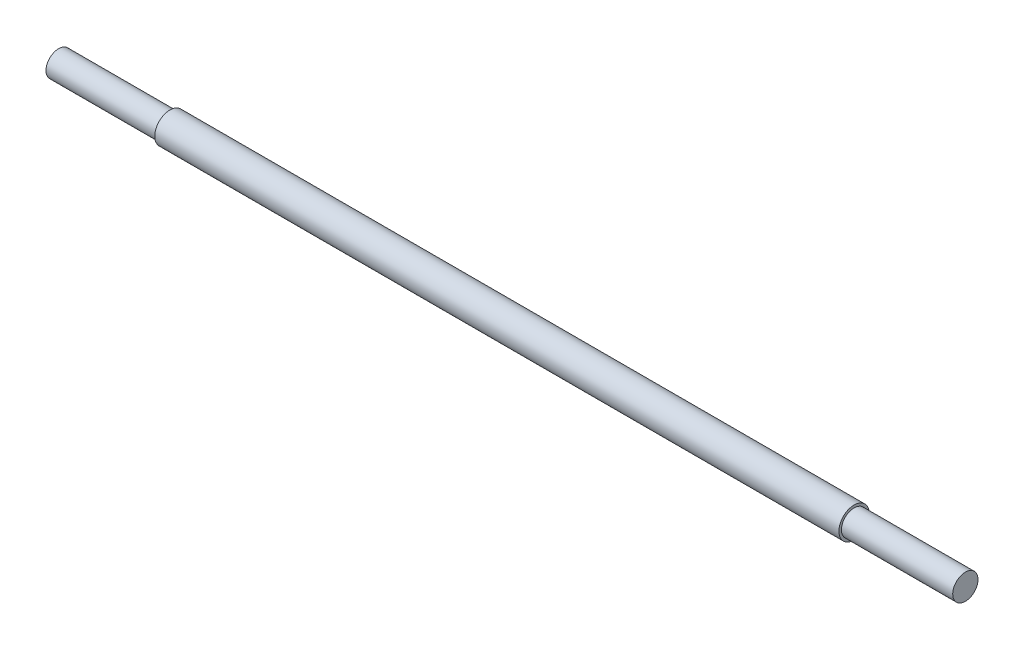
ISO-10303-21;
HEADER;
FILE_DESCRIPTION(('STEP AP214'),'2;1');
FILE_NAME('part.step','',(''),(''),'','','');
FILE_SCHEMA(('AUTOMOTIVE_DESIGN { 1 0 10303 214 1 1 1 1 }'));
ENDSEC;
DATA;
#1=APPLICATION_CONTEXT('core data for automotive mechanical design processes');
#2=APPLICATION_PROTOCOL_DEFINITION('international standard','automotive_design',2000,#1);
#3=PRODUCT_CONTEXT('',#1,'mechanical');
#4=PRODUCT('Part','Part','',(#3));
#5=PRODUCT_RELATED_PRODUCT_CATEGORY('part','',(#4));
#6=PRODUCT_DEFINITION_FORMATION('','',#4);
#7=PRODUCT_DEFINITION_CONTEXT('part definition',#1,'design');
#8=PRODUCT_DEFINITION('design','',#6,#7);
#9=PRODUCT_DEFINITION_SHAPE('','',#8);
#10=(LENGTH_UNIT() NAMED_UNIT(*) SI_UNIT(.MILLI.,.METRE.));
#11=(NAMED_UNIT(*) PLANE_ANGLE_UNIT() SI_UNIT($,.RADIAN.));
#12=(NAMED_UNIT(*) SI_UNIT($,.STERADIAN.) SOLID_ANGLE_UNIT());
#13=UNCERTAINTY_MEASURE_WITH_UNIT(LENGTH_MEASURE(1.E-05),#10,'distance_accuracy_value','');
#14=(GEOMETRIC_REPRESENTATION_CONTEXT(3) GLOBAL_UNCERTAINTY_ASSIGNED_CONTEXT((#13)) GLOBAL_UNIT_ASSIGNED_CONTEXT((#10,
#11,#12)) REPRESENTATION_CONTEXT('',''));
#15=CARTESIAN_POINT('',(0.,0.,0.));
#16=DIRECTION('',(0.,0.,1.));
#17=DIRECTION('',(1.,0.,0.));
#18=AXIS2_PLACEMENT_3D('',#15,#16,#17);
#19=CARTESIAN_POINT('',(0.,1.25000000000001,0.));
#20=DIRECTION('',(1.,0.,0.));
#21=DIRECTION('',(0.,1.,0.));
#22=AXIS2_PLACEMENT_3D('',#19,#20,#21);
#23=PLANE('',#22);
#24=CARTESIAN_POINT('',(0.,0.,0.));
#25=DIRECTION('',(-1.,0.,0.));
#26=DIRECTION('',(0.,-1.,0.));
#27=AXIS2_PLACEMENT_3D('',#24,#25,#26);
#28=CIRCLE('',#27,1.25000000000001);
#29=CARTESIAN_POINT('',(0.,-1.25000000000001,0.));
#30=VERTEX_POINT('',#29);
#31=EDGE_CURVE('E53',#30,#30,#28,.T.);
#32=ORIENTED_EDGE('',*,*,#31,.T.);
#33=EDGE_LOOP('',(#32));
#34=FACE_BOUND('',#33,.T.);
#35=ADVANCED_FACE('F31',(#34),#23,.F.);
#36=CARTESIAN_POINT('',(89.63,0.,0.));
#37=DIRECTION('',(-1.,0.,0.));
#38=DIRECTION('',(0.,-1.,0.));
#39=AXIS2_PLACEMENT_3D('',#36,#37,#38);
#40=PLANE('',#39);
#41=CARTESIAN_POINT('',(89.63,0.,0.));
#42=DIRECTION('',(-1.,0.,0.));
#43=DIRECTION('',(0.,-1.,0.));
#44=AXIS2_PLACEMENT_3D('',#41,#42,#43);
#45=CIRCLE('',#44,1.25);
#46=CARTESIAN_POINT('',(89.63,-1.25,0.));
#47=VERTEX_POINT('',#46);
#48=EDGE_CURVE('E10',#47,#47,#45,.T.);
#49=ORIENTED_EDGE('',*,*,#48,.F.);
#50=EDGE_LOOP('',(#49));
#51=FACE_BOUND('',#50,.T.);
#52=ADVANCED_FACE('F83',(#51),#40,.F.);
#53=CARTESIAN_POINT('',(0.,0.,0.));
#54=DIRECTION('',(-1.,0.,0.));
#55=DIRECTION('',(0.,-1.,0.));
#56=AXIS2_PLACEMENT_3D('',#53,#54,#55);
#57=CYLINDRICAL_SURFACE('',#56,1.25);
#58=CARTESIAN_POINT('',(78.63,0.,0.));
#59=DIRECTION('',(-1.,0.,0.));
#60=DIRECTION('',(0.,-1.,0.));
#61=AXIS2_PLACEMENT_3D('',#58,#59,#60);
#62=CIRCLE('',#61,1.25);
#63=CARTESIAN_POINT('',(78.63,-1.25,0.));
#64=VERTEX_POINT('',#63);
#65=EDGE_CURVE('E37',#64,#64,#62,.T.);
#66=ORIENTED_EDGE('',*,*,#65,.F.);
#67=EDGE_LOOP('',(#66));
#68=FACE_BOUND('',#67,.T.);
#69=ORIENTED_EDGE('',*,*,#48,.T.);
#70=EDGE_LOOP('',(#69));
#71=FACE_BOUND('',#70,.T.);
#72=ADVANCED_FACE('F78',(#68,#71),#57,.T.);
#73=CARTESIAN_POINT('',(78.63,1.25,0.));
#74=DIRECTION('',(-1.,0.,0.));
#75=DIRECTION('',(0.,-1.,0.));
#76=AXIS2_PLACEMENT_3D('',#73,#74,#75);
#77=PLANE('',#76);
#78=CARTESIAN_POINT('',(78.63,0.,0.));
#79=DIRECTION('',(-1.,0.,0.));
#80=DIRECTION('',(0.,-1.,0.));
#81=AXIS2_PLACEMENT_3D('',#78,#79,#80);
#82=CIRCLE('',#81,1.5);
#83=CARTESIAN_POINT('',(78.63,-1.5,0.));
#84=VERTEX_POINT('',#83);
#85=EDGE_CURVE('E41',#84,#84,#82,.T.);
#86=ORIENTED_EDGE('',*,*,#85,.F.);
#87=EDGE_LOOP('',(#86));
#88=FACE_BOUND('',#87,.T.);
#89=ORIENTED_EDGE('',*,*,#65,.T.);
#90=EDGE_LOOP('',(#89));
#91=FACE_BOUND('',#90,.T.);
#92=ADVANCED_FACE('F73',(#88,#91),#77,.F.);
#93=CARTESIAN_POINT('',(0.,0.,0.));
#94=DIRECTION('',(-1.,0.,0.));
#95=DIRECTION('',(0.,-1.,0.));
#96=AXIS2_PLACEMENT_3D('',#93,#94,#95);
#97=CYLINDRICAL_SURFACE('',#96,1.5);
#98=CARTESIAN_POINT('',(11.,0.,0.));
#99=DIRECTION('',(-1.,0.,0.));
#100=DIRECTION('',(0.,-1.,0.));
#101=AXIS2_PLACEMENT_3D('',#98,#99,#100);
#102=CIRCLE('',#101,1.49999999999999);
#103=CARTESIAN_POINT('',(11.,-1.49999999999999,0.));
#104=VERTEX_POINT('',#103);
#105=EDGE_CURVE('E45',#104,#104,#102,.T.);
#106=ORIENTED_EDGE('',*,*,#105,.F.);
#107=EDGE_LOOP('',(#106));
#108=FACE_BOUND('',#107,.T.);
#109=ORIENTED_EDGE('',*,*,#85,.T.);
#110=EDGE_LOOP('',(#109));
#111=FACE_BOUND('',#110,.T.);
#112=ADVANCED_FACE('F67',(#108,#111),#97,.T.);
#113=CARTESIAN_POINT('',(11.,1.49999999999999,0.));
#114=DIRECTION('',(1.,0.,0.));
#115=DIRECTION('',(0.,1.,0.));
#116=AXIS2_PLACEMENT_3D('',#113,#114,#115);
#117=PLANE('',#116);
#118=CARTESIAN_POINT('',(11.,0.,0.));
#119=DIRECTION('',(-1.,0.,0.));
#120=DIRECTION('',(0.,-1.,0.));
#121=AXIS2_PLACEMENT_3D('',#118,#119,#120);
#122=CIRCLE('',#121,1.25000000000001);
#123=CARTESIAN_POINT('',(11.,-1.25000000000001,0.));
#124=VERTEX_POINT('',#123);
#125=EDGE_CURVE('E50',#124,#124,#122,.T.);
#126=ORIENTED_EDGE('',*,*,#125,.F.);
#127=EDGE_LOOP('',(#126));
#128=FACE_BOUND('',#127,.T.);
#129=ORIENTED_EDGE('',*,*,#105,.T.);
#130=EDGE_LOOP('',(#129));
#131=FACE_BOUND('',#130,.T.);
#132=ADVANCED_FACE('F61',(#128,#131),#117,.F.);
#133=CARTESIAN_POINT('',(0.,0.,0.));
#134=DIRECTION('',(-1.,0.,0.));
#135=DIRECTION('',(0.,-1.,0.));
#136=AXIS2_PLACEMENT_3D('',#133,#134,#135);
#137=CYLINDRICAL_SURFACE('',#136,1.25000000000001);
#138=ORIENTED_EDGE('',*,*,#31,.F.);
#139=EDGE_LOOP('',(#138));
#140=FACE_BOUND('',#139,.T.);
#141=ORIENTED_EDGE('',*,*,#125,.T.);
#142=EDGE_LOOP('',(#141));
#143=FACE_BOUND('',#142,.T.);
#144=ADVANCED_FACE('F58',(#140,#143),#137,.T.);
#145=CLOSED_SHELL('',(#35,#52,#72,#92,#112,#132,#144));
#146=MANIFOLD_SOLID_BREP('B2',#145);
#147=ADVANCED_BREP_SHAPE_REPRESENTATION('',(#18,#146),#14);
#148=SHAPE_DEFINITION_REPRESENTATION(#9,#147);
ENDSEC;
END-ISO-10303-21;
